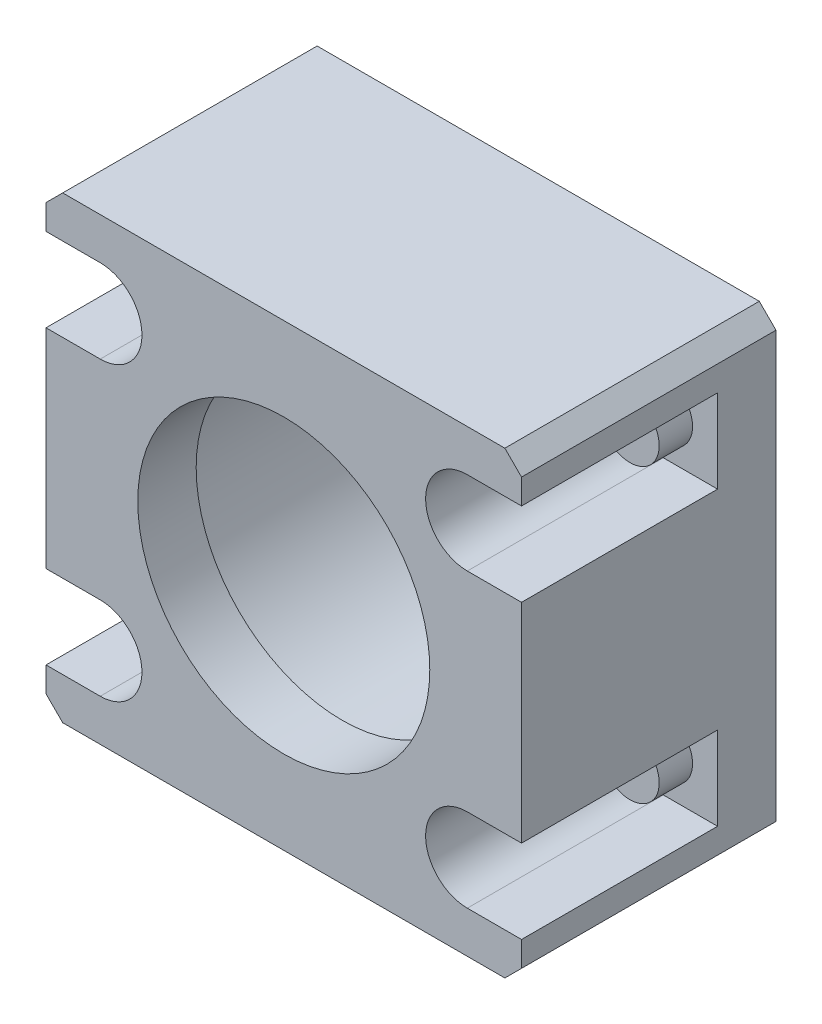
ISO-10303-21;
HEADER;
FILE_DESCRIPTION(('STEP AP214'),'2;1');
FILE_NAME('part.step','',(''),(''),'','','');
FILE_SCHEMA(('AUTOMOTIVE_DESIGN { 1 0 10303 214 1 1 1 1 }'));
ENDSEC;
DATA;
#1=APPLICATION_CONTEXT('core data for automotive mechanical design processes');
#2=APPLICATION_PROTOCOL_DEFINITION('international standard','automotive_design',2000,#1);
#3=PRODUCT_CONTEXT('',#1,'mechanical');
#4=PRODUCT('Part','Part','',(#3));
#5=PRODUCT_RELATED_PRODUCT_CATEGORY('part','',(#4));
#6=PRODUCT_DEFINITION_FORMATION('','',#4);
#7=PRODUCT_DEFINITION_CONTEXT('part definition',#1,'design');
#8=PRODUCT_DEFINITION('design','',#6,#7);
#9=PRODUCT_DEFINITION_SHAPE('','',#8);
#10=(LENGTH_UNIT() NAMED_UNIT(*) SI_UNIT(.MILLI.,.METRE.));
#11=(NAMED_UNIT(*) PLANE_ANGLE_UNIT() SI_UNIT($,.RADIAN.));
#12=(NAMED_UNIT(*) SI_UNIT($,.STERADIAN.) SOLID_ANGLE_UNIT());
#13=UNCERTAINTY_MEASURE_WITH_UNIT(LENGTH_MEASURE(1.E-05),#10,'distance_accuracy_value','');
#14=(GEOMETRIC_REPRESENTATION_CONTEXT(3) GLOBAL_UNCERTAINTY_ASSIGNED_CONTEXT((#13)) GLOBAL_UNIT_ASSIGNED_CONTEXT((#10,
#11,#12)) REPRESENTATION_CONTEXT('',''));
#15=CARTESIAN_POINT('',(0.,0.,0.));
#16=DIRECTION('',(0.,0.,1.));
#17=DIRECTION('',(1.,0.,0.));
#18=AXIS2_PLACEMENT_3D('',#15,#16,#17);
#19=CARTESIAN_POINT('',(0.,0.,11.));
#20=DIRECTION('',(0.,0.,1.));
#21=DIRECTION('',(1.,0.,0.));
#22=AXIS2_PLACEMENT_3D('',#19,#20,#21);
#23=PLANE('',#22);
#24=CARTESIAN_POINT('',(22.,-17.5,11.));
#25=DIRECTION('',(0.,0.,1.));
#26=DIRECTION('',(1.,0.,0.));
#27=AXIS2_PLACEMENT_3D('',#24,#25,#26);
#28=CIRCLE('',#27,3.5);
#29=CARTESIAN_POINT('',(25.5,-17.5,11.));
#30=VERTEX_POINT('',#29);
#31=EDGE_CURVE('E19',#30,#30,#28,.F.);
#32=ORIENTED_EDGE('',*,*,#31,.F.);
#33=EDGE_LOOP('',(#32));
#34=FACE_BOUND('',#33,.T.);
#35=ADVANCED_FACE('F16',(#34),#23,.T.);
#36=CARTESIAN_POINT('',(0.,0.,11.));
#37=DIRECTION('',(0.,0.,1.));
#38=DIRECTION('',(1.,0.,0.));
#39=AXIS2_PLACEMENT_3D('',#36,#37,#38);
#40=PLANE('',#39);
#41=CARTESIAN_POINT('',(22.,17.5,11.));
#42=DIRECTION('',(0.,0.,1.));
#43=DIRECTION('',(1.,0.,0.));
#44=AXIS2_PLACEMENT_3D('',#41,#42,#43);
#45=CIRCLE('',#44,3.5);
#46=CARTESIAN_POINT('',(25.5,17.5,11.));
#47=VERTEX_POINT('',#46);
#48=EDGE_CURVE('E273',#47,#47,#45,.F.);
#49=ORIENTED_EDGE('',*,*,#48,.F.);
#50=EDGE_LOOP('',(#49));
#51=FACE_BOUND('',#50,.T.);
#52=ADVANCED_FACE('F284',(#51),#40,.T.);
#53=CARTESIAN_POINT('',(0.,0.,11.));
#54=DIRECTION('',(0.,0.,1.));
#55=DIRECTION('',(1.,0.,0.));
#56=AXIS2_PLACEMENT_3D('',#53,#54,#55);
#57=PLANE('',#56);
#58=CARTESIAN_POINT('',(-22.,17.5,11.));
#59=DIRECTION('',(0.,0.,1.));
#60=DIRECTION('',(1.,0.,0.));
#61=AXIS2_PLACEMENT_3D('',#58,#59,#60);
#62=CIRCLE('',#61,3.5);
#63=CARTESIAN_POINT('',(-18.5,17.5,11.));
#64=VERTEX_POINT('',#63);
#65=EDGE_CURVE('E271',#64,#64,#62,.F.);
#66=ORIENTED_EDGE('',*,*,#65,.F.);
#67=EDGE_LOOP('',(#66));
#68=FACE_BOUND('',#67,.T.);
#69=ADVANCED_FACE('F289',(#68),#57,.T.);
#70=CARTESIAN_POINT('',(0.,0.,11.));
#71=DIRECTION('',(0.,0.,1.));
#72=DIRECTION('',(1.,0.,0.));
#73=AXIS2_PLACEMENT_3D('',#70,#71,#72);
#74=PLANE('',#73);
#75=CARTESIAN_POINT('',(-22.,-17.5,11.));
#76=DIRECTION('',(0.,0.,1.));
#77=DIRECTION('',(1.,0.,0.));
#78=AXIS2_PLACEMENT_3D('',#75,#76,#77);
#79=CIRCLE('',#78,3.5);
#80=CARTESIAN_POINT('',(-18.5,-17.5,11.));
#81=VERTEX_POINT('',#80);
#82=EDGE_CURVE('E268',#81,#81,#79,.F.);
#83=ORIENTED_EDGE('',*,*,#82,.F.);
#84=EDGE_LOOP('',(#83));
#85=FACE_BOUND('',#84,.T.);
#86=ADVANCED_FACE('F417',(#85),#74,.T.);
#87=CARTESIAN_POINT('',(22.,-17.5,7.));
#88=DIRECTION('',(0.,0.,1.));
#89=DIRECTION('',(1.,0.,0.));
#90=AXIS2_PLACEMENT_3D('',#87,#88,#89);
#91=CYLINDRICAL_SURFACE('',#90,3.5);
#92=ORIENTED_EDGE('',*,*,#31,.T.);
#93=EDGE_LOOP('',(#92));
#94=FACE_BOUND('',#93,.T.);
#95=CARTESIAN_POINT('',(22.,-17.5,7.));
#96=DIRECTION('',(0.,0.,1.));
#97=DIRECTION('',(1.,0.,0.));
#98=AXIS2_PLACEMENT_3D('',#95,#96,#97);
#99=CIRCLE('',#98,3.5);
#100=CARTESIAN_POINT('',(25.5,-17.5,7.));
#101=VERTEX_POINT('',#100);
#102=EDGE_CURVE('E190',#101,#101,#99,.F.);
#103=ORIENTED_EDGE('',*,*,#102,.F.);
#104=EDGE_LOOP('',(#103));
#105=FACE_BOUND('',#104,.T.);
#106=ADVANCED_FACE('F280',(#94,#105),#91,.T.);
#107=CARTESIAN_POINT('',(22.,17.5,7.));
#108=DIRECTION('',(0.,0.,1.));
#109=DIRECTION('',(1.,0.,0.));
#110=AXIS2_PLACEMENT_3D('',#107,#108,#109);
#111=CYLINDRICAL_SURFACE('',#110,3.5);
#112=ORIENTED_EDGE('',*,*,#48,.T.);
#113=EDGE_LOOP('',(#112));
#114=FACE_BOUND('',#113,.T.);
#115=CARTESIAN_POINT('',(22.,17.5,7.));
#116=DIRECTION('',(0.,0.,1.));
#117=DIRECTION('',(1.,0.,0.));
#118=AXIS2_PLACEMENT_3D('',#115,#116,#117);
#119=CIRCLE('',#118,3.5);
#120=CARTESIAN_POINT('',(25.5,17.5,7.));
#121=VERTEX_POINT('',#120);
#122=EDGE_CURVE('E259',#121,#121,#119,.F.);
#123=ORIENTED_EDGE('',*,*,#122,.F.);
#124=EDGE_LOOP('',(#123));
#125=FACE_BOUND('',#124,.T.);
#126=ADVANCED_FACE('F411',(#114,#125),#111,.T.);
#127=CARTESIAN_POINT('',(-22.,17.5,7.));
#128=DIRECTION('',(0.,0.,1.));
#129=DIRECTION('',(1.,0.,0.));
#130=AXIS2_PLACEMENT_3D('',#127,#128,#129);
#131=CYLINDRICAL_SURFACE('',#130,3.5);
#132=ORIENTED_EDGE('',*,*,#65,.T.);
#133=EDGE_LOOP('',(#132));
#134=FACE_BOUND('',#133,.T.);
#135=CARTESIAN_POINT('',(-22.,17.5,7.));
#136=DIRECTION('',(0.,0.,1.));
#137=DIRECTION('',(1.,0.,0.));
#138=AXIS2_PLACEMENT_3D('',#135,#136,#137);
#139=CIRCLE('',#138,3.5);
#140=CARTESIAN_POINT('',(-18.5,17.5,7.));
#141=VERTEX_POINT('',#140);
#142=EDGE_CURVE('E251',#141,#141,#139,.F.);
#143=ORIENTED_EDGE('',*,*,#142,.F.);
#144=EDGE_LOOP('',(#143));
#145=FACE_BOUND('',#144,.T.);
#146=ADVANCED_FACE('F407',(#134,#145),#131,.T.);
#147=CARTESIAN_POINT('',(-22.,-17.5,7.));
#148=DIRECTION('',(0.,0.,1.));
#149=DIRECTION('',(1.,0.,0.));
#150=AXIS2_PLACEMENT_3D('',#147,#148,#149);
#151=CYLINDRICAL_SURFACE('',#150,3.5);
#152=ORIENTED_EDGE('',*,*,#82,.T.);
#153=EDGE_LOOP('',(#152));
#154=FACE_BOUND('',#153,.T.);
#155=CARTESIAN_POINT('',(-22.,-17.5,7.));
#156=DIRECTION('',(0.,0.,1.));
#157=DIRECTION('',(1.,0.,0.));
#158=AXIS2_PLACEMENT_3D('',#155,#156,#157);
#159=CIRCLE('',#158,3.5);
#160=CARTESIAN_POINT('',(-18.5,-17.5,7.));
#161=VERTEX_POINT('',#160);
#162=EDGE_CURVE('E243',#161,#161,#159,.F.);
#163=ORIENTED_EDGE('',*,*,#162,.F.);
#164=EDGE_LOOP('',(#163));
#165=FACE_BOUND('',#164,.T.);
#166=ADVANCED_FACE('F403',(#154,#165),#151,.T.);
#167=CARTESIAN_POINT('',(22.,17.5,30.5));
#168=DIRECTION('',(0.,0.,1.));
#169=DIRECTION('',(1.,0.,0.));
#170=AXIS2_PLACEMENT_3D('',#167,#168,#169);
#171=CYLINDRICAL_SURFACE('',#170,5.);
#172=DIRECTION('',(0.,0.,-1.));
#173=VECTOR('',#172,1.);
#174=CARTESIAN_POINT('',(22.,12.5,30.5));
#175=LINE('',#174,#173);
#176=CARTESIAN_POINT('',(22.,12.5,30.5));
#177=VERTEX_POINT('',#176);
#178=CARTESIAN_POINT('',(22.,12.5,7.));
#179=VERTEX_POINT('',#178);
#180=EDGE_CURVE('E262',#177,#179,#175,.T.);
#181=ORIENTED_EDGE('',*,*,#180,.T.);
#182=CARTESIAN_POINT('',(22.,17.5,7.));
#183=DIRECTION('',(0.,0.,1.));
#184=DIRECTION('',(1.,0.,0.));
#185=AXIS2_PLACEMENT_3D('',#182,#183,#184);
#186=CIRCLE('',#185,5.);
#187=CARTESIAN_POINT('',(22.,22.5,7.));
#188=VERTEX_POINT('',#187);
#189=EDGE_CURVE('E263',#188,#179,#186,.T.);
#190=ORIENTED_EDGE('',*,*,#189,.F.);
#191=DIRECTION('',(0.,0.,1.));
#192=VECTOR('',#191,1.);
#193=CARTESIAN_POINT('',(22.,22.5,30.5));
#194=LINE('',#193,#192);
#195=CARTESIAN_POINT('',(22.,22.5,30.5));
#196=VERTEX_POINT('',#195);
#197=EDGE_CURVE('E202',#188,#196,#194,.T.);
#198=ORIENTED_EDGE('',*,*,#197,.T.);
#199=CARTESIAN_POINT('',(22.,17.5,30.5));
#200=DIRECTION('',(0.,0.,1.));
#201=DIRECTION('',(1.,0.,0.));
#202=AXIS2_PLACEMENT_3D('',#199,#200,#201);
#203=CIRCLE('',#202,5.);
#204=EDGE_CURVE('E239',#196,#177,#203,.T.);
#205=ORIENTED_EDGE('',*,*,#204,.T.);
#206=EDGE_LOOP('',(#181,#190,#198,#205));
#207=FACE_BOUND('',#206,.T.);
#208=ADVANCED_FACE('F400',(#207),#171,.F.);
#209=CARTESIAN_POINT('',(22.,-17.5,30.5));
#210=DIRECTION('',(0.,0.,1.));
#211=DIRECTION('',(1.,0.,0.));
#212=AXIS2_PLACEMENT_3D('',#209,#210,#211);
#213=CYLINDRICAL_SURFACE('',#212,5.);
#214=DIRECTION('',(0.,0.,1.));
#215=VECTOR('',#214,1.);
#216=CARTESIAN_POINT('',(22.,-12.5,30.5));
#217=LINE('',#216,#215);
#218=CARTESIAN_POINT('',(22.,-12.5,7.));
#219=VERTEX_POINT('',#218);
#220=CARTESIAN_POINT('',(22.,-12.5,30.5));
#221=VERTEX_POINT('',#220);
#222=EDGE_CURVE('E174',#219,#221,#217,.T.);
#223=ORIENTED_EDGE('',*,*,#222,.T.);
#224=CARTESIAN_POINT('',(22.,-17.5,30.5));
#225=DIRECTION('',(0.,0.,1.));
#226=DIRECTION('',(1.,0.,0.));
#227=AXIS2_PLACEMENT_3D('',#224,#225,#226);
#228=CIRCLE('',#227,5.);
#229=CARTESIAN_POINT('',(22.,-22.5,30.5));
#230=VERTEX_POINT('',#229);
#231=EDGE_CURVE('E185',#221,#230,#228,.T.);
#232=ORIENTED_EDGE('',*,*,#231,.T.);
#233=DIRECTION('',(0.,0.,-1.));
#234=VECTOR('',#233,1.);
#235=CARTESIAN_POINT('',(22.,-22.5,30.5));
#236=LINE('',#235,#234);
#237=CARTESIAN_POINT('',(22.,-22.5,7.));
#238=VERTEX_POINT('',#237);
#239=EDGE_CURVE('E179',#230,#238,#236,.T.);
#240=ORIENTED_EDGE('',*,*,#239,.T.);
#241=CARTESIAN_POINT('',(22.,-17.5,7.));
#242=DIRECTION('',(0.,0.,1.));
#243=DIRECTION('',(1.,0.,0.));
#244=AXIS2_PLACEMENT_3D('',#241,#242,#243);
#245=CIRCLE('',#244,5.);
#246=EDGE_CURVE('E182',#219,#238,#245,.T.);
#247=ORIENTED_EDGE('',*,*,#246,.F.);
#248=EDGE_LOOP('',(#223,#232,#240,#247));
#249=FACE_BOUND('',#248,.T.);
#250=ADVANCED_FACE('F181',(#249),#213,.F.);
#251=CARTESIAN_POINT('',(-22.,-17.5,30.5));
#252=DIRECTION('',(0.,0.,1.));
#253=DIRECTION('',(1.,0.,0.));
#254=AXIS2_PLACEMENT_3D('',#251,#252,#253);
#255=CYLINDRICAL_SURFACE('',#254,5.);
#256=DIRECTION('',(0.,0.,1.));
#257=VECTOR('',#256,1.);
#258=CARTESIAN_POINT('',(-22.,-12.5,30.5));
#259=LINE('',#258,#257);
#260=CARTESIAN_POINT('',(-22.,-12.5,30.5));
#261=VERTEX_POINT('',#260);
#262=CARTESIAN_POINT('',(-22.,-12.5,7.));
#263=VERTEX_POINT('',#262);
#264=EDGE_CURVE('E246',#261,#263,#259,.F.);
#265=ORIENTED_EDGE('',*,*,#264,.T.);
#266=CARTESIAN_POINT('',(-22.,-17.5,7.));
#267=DIRECTION('',(0.,0.,1.));
#268=DIRECTION('',(1.,0.,0.));
#269=AXIS2_PLACEMENT_3D('',#266,#267,#268);
#270=CIRCLE('',#269,5.);
#271=CARTESIAN_POINT('',(-22.,-22.5,7.));
#272=VERTEX_POINT('',#271);
#273=EDGE_CURVE('E247',#272,#263,#270,.T.);
#274=ORIENTED_EDGE('',*,*,#273,.F.);
#275=DIRECTION('',(0.,0.,-1.));
#276=VECTOR('',#275,1.);
#277=CARTESIAN_POINT('',(-22.,-22.5,30.5));
#278=LINE('',#277,#276);
#279=CARTESIAN_POINT('',(-22.,-22.5,30.5));
#280=VERTEX_POINT('',#279);
#281=EDGE_CURVE('E436',#272,#280,#278,.F.);
#282=ORIENTED_EDGE('',*,*,#281,.T.);
#283=CARTESIAN_POINT('',(-22.,-17.5,30.5));
#284=DIRECTION('',(0.,0.,1.));
#285=DIRECTION('',(1.,0.,0.));
#286=AXIS2_PLACEMENT_3D('',#283,#284,#285);
#287=CIRCLE('',#286,5.);
#288=EDGE_CURVE('E232',#280,#261,#287,.T.);
#289=ORIENTED_EDGE('',*,*,#288,.T.);
#290=EDGE_LOOP('',(#265,#274,#282,#289));
#291=FACE_BOUND('',#290,.T.);
#292=ADVANCED_FACE('F393',(#291),#255,.F.);
#293=CARTESIAN_POINT('',(-22.,17.5,30.5));
#294=DIRECTION('',(0.,0.,1.));
#295=DIRECTION('',(1.,0.,0.));
#296=AXIS2_PLACEMENT_3D('',#293,#294,#295);
#297=CYLINDRICAL_SURFACE('',#296,5.);
#298=DIRECTION('',(0.,0.,-1.));
#299=VECTOR('',#298,1.);
#300=CARTESIAN_POINT('',(-22.,12.5,30.5));
#301=LINE('',#300,#299);
#302=CARTESIAN_POINT('',(-22.,12.5,7.));
#303=VERTEX_POINT('',#302);
#304=CARTESIAN_POINT('',(-22.,12.5,30.5));
#305=VERTEX_POINT('',#304);
#306=EDGE_CURVE('E503',#303,#305,#301,.F.);
#307=ORIENTED_EDGE('',*,*,#306,.T.);
#308=CARTESIAN_POINT('',(-22.,17.5,30.5));
#309=DIRECTION('',(0.,0.,1.));
#310=DIRECTION('',(1.,0.,0.));
#311=AXIS2_PLACEMENT_3D('',#308,#309,#310);
#312=CIRCLE('',#311,5.);
#313=CARTESIAN_POINT('',(-22.,22.5,30.5));
#314=VERTEX_POINT('',#313);
#315=EDGE_CURVE('E228',#305,#314,#312,.T.);
#316=ORIENTED_EDGE('',*,*,#315,.T.);
#317=DIRECTION('',(0.,0.,1.));
#318=VECTOR('',#317,1.);
#319=CARTESIAN_POINT('',(-22.,22.5,30.5));
#320=LINE('',#319,#318);
#321=CARTESIAN_POINT('',(-22.,22.5,7.));
#322=VERTEX_POINT('',#321);
#323=EDGE_CURVE('E254',#314,#322,#320,.F.);
#324=ORIENTED_EDGE('',*,*,#323,.T.);
#325=CARTESIAN_POINT('',(-22.,17.5,7.));
#326=DIRECTION('',(0.,0.,1.));
#327=DIRECTION('',(1.,0.,0.));
#328=AXIS2_PLACEMENT_3D('',#325,#326,#327);
#329=CIRCLE('',#328,5.);
#330=EDGE_CURVE('E255',#303,#322,#329,.T.);
#331=ORIENTED_EDGE('',*,*,#330,.F.);
#332=EDGE_LOOP('',(#307,#316,#324,#331));
#333=FACE_BOUND('',#332,.T.);
#334=ADVANCED_FACE('F389',(#333),#297,.F.);
#335=CARTESIAN_POINT('',(0.,0.,32.025));
#336=DIRECTION('',(0.,0.,-1.));
#337=DIRECTION('',(-1.,0.,0.));
#338=AXIS2_PLACEMENT_3D('',#335,#336,#337);
#339=CYLINDRICAL_SURFACE('',#338,17.5);
#340=CARTESIAN_POINT('',(0.,0.,23.5));
#341=DIRECTION('',(0.,0.,-1.));
#342=DIRECTION('',(-1.,0.,0.));
#343=AXIS2_PLACEMENT_3D('',#340,#341,#342);
#344=CIRCLE('',#343,17.5);
#345=CARTESIAN_POINT('',(-17.5,0.,23.5));
#346=VERTEX_POINT('',#345);
#347=EDGE_CURVE('E221',#346,#346,#344,.F.);
#348=ORIENTED_EDGE('',*,*,#347,.F.);
#349=EDGE_LOOP('',(#348));
#350=FACE_BOUND('',#349,.T.);
#351=CARTESIAN_POINT('',(0.,0.,30.5));
#352=DIRECTION('',(0.,0.,-1.));
#353=DIRECTION('',(-1.,0.,0.));
#354=AXIS2_PLACEMENT_3D('',#351,#352,#353);
#355=CIRCLE('',#354,17.5);
#356=CARTESIAN_POINT('',(-17.5,0.,30.5));
#357=VERTEX_POINT('',#356);
#358=EDGE_CURVE('E225',#357,#357,#355,.F.);
#359=ORIENTED_EDGE('',*,*,#358,.T.);
#360=EDGE_LOOP('',(#359));
#361=FACE_BOUND('',#360,.T.);
#362=ADVANCED_FACE('F386',(#350,#361),#339,.F.);
#363=CARTESIAN_POINT('',(28.5,-12.5,30.5));
#364=DIRECTION('',(0.,1.,0.));
#365=DIRECTION('',(0.,0.,1.));
#366=AXIS2_PLACEMENT_3D('',#363,#364,#365);
#367=PLANE('',#366);
#368=ORIENTED_EDGE('',*,*,#222,.F.);
#369=DIRECTION('',(1.,0.,0.));
#370=VECTOR('',#369,1.);
#371=CARTESIAN_POINT('',(0.,-12.5,7.));
#372=LINE('',#371,#370);
#373=CARTESIAN_POINT('',(28.5,-12.5,7.));
#374=VERTEX_POINT('',#373);
#375=EDGE_CURVE('E196',#374,#219,#372,.F.);
#376=ORIENTED_EDGE('',*,*,#375,.F.);
#377=DIRECTION('',(0.,0.,-1.));
#378=VECTOR('',#377,1.);
#379=CARTESIAN_POINT('',(28.5,-12.5,0.));
#380=LINE('',#379,#378);
#381=CARTESIAN_POINT('',(28.5,-12.5,30.5));
#382=VERTEX_POINT('',#381);
#383=EDGE_CURVE('E214',#382,#374,#380,.T.);
#384=ORIENTED_EDGE('',*,*,#383,.F.);
#385=DIRECTION('',(-1.,0.,0.));
#386=VECTOR('',#385,1.);
#387=CARTESIAN_POINT('',(0.,-12.5,30.5));
#388=LINE('',#387,#386);
#389=EDGE_CURVE('E238',#382,#221,#388,.T.);
#390=ORIENTED_EDGE('',*,*,#389,.T.);
#391=EDGE_LOOP('',(#368,#376,#384,#390));
#392=FACE_BOUND('',#391,.T.);
#393=ADVANCED_FACE('F382',(#392),#367,.F.);
#394=CARTESIAN_POINT('',(0.,0.,7.));
#395=DIRECTION('',(0.,0.,1.));
#396=DIRECTION('',(1.,0.,0.));
#397=AXIS2_PLACEMENT_3D('',#394,#395,#396);
#398=PLANE('',#397);
#399=ORIENTED_EDGE('',*,*,#102,.T.);
#400=EDGE_LOOP('',(#399));
#401=FACE_BOUND('',#400,.T.);
#402=DIRECTION('',(1.,0.,0.));
#403=VECTOR('',#402,1.);
#404=CARTESIAN_POINT('',(22.,-22.5,7.));
#405=LINE('',#404,#403);
#406=CARTESIAN_POINT('',(28.5,-22.5,7.));
#407=VERTEX_POINT('',#406);
#408=EDGE_CURVE('E189',#238,#407,#405,.T.);
#409=ORIENTED_EDGE('',*,*,#408,.T.);
#410=DIRECTION('',(0.,1.,0.));
#411=VECTOR('',#410,1.);
#412=CARTESIAN_POINT('',(28.5,27.5,7.));
#413=LINE('',#412,#411);
#414=EDGE_CURVE('E212',#374,#407,#413,.F.);
#415=ORIENTED_EDGE('',*,*,#414,.F.);
#416=ORIENTED_EDGE('',*,*,#375,.T.);
#417=ORIENTED_EDGE('',*,*,#246,.T.);
#418=EDGE_LOOP('',(#409,#415,#416,#417));
#419=FACE_BOUND('',#418,.T.);
#420=ADVANCED_FACE('F193',(#401,#419),#398,.T.);
#421=CARTESIAN_POINT('',(22.,-22.5,30.5));
#422=DIRECTION('',(0.,-1.,0.));
#423=DIRECTION('',(0.,0.,-1.));
#424=AXIS2_PLACEMENT_3D('',#421,#422,#423);
#425=PLANE('',#424);
#426=DIRECTION('',(0.,0.,-1.));
#427=VECTOR('',#426,1.);
#428=CARTESIAN_POINT('',(28.5,-22.5,0.));
#429=LINE('',#428,#427);
#430=CARTESIAN_POINT('',(28.5,-22.5,30.5));
#431=VERTEX_POINT('',#430);
#432=EDGE_CURVE('E200',#407,#431,#429,.F.);
#433=ORIENTED_EDGE('',*,*,#432,.F.);
#434=ORIENTED_EDGE('',*,*,#408,.F.);
#435=ORIENTED_EDGE('',*,*,#239,.F.);
#436=DIRECTION('',(-1.,0.,0.));
#437=VECTOR('',#436,1.);
#438=CARTESIAN_POINT('',(0.,-22.5,30.5));
#439=LINE('',#438,#437);
#440=EDGE_CURVE('E237',#230,#431,#439,.F.);
#441=ORIENTED_EDGE('',*,*,#440,.T.);
#442=EDGE_LOOP('',(#433,#434,#435,#441));
#443=FACE_BOUND('',#442,.T.);
#444=ADVANCED_FACE('F198',(#443),#425,.F.);
#445=CARTESIAN_POINT('',(28.5,22.5,30.5));
#446=DIRECTION('',(0.,1.,0.));
#447=DIRECTION('',(0.,0.,1.));
#448=AXIS2_PLACEMENT_3D('',#445,#446,#447);
#449=PLANE('',#448);
#450=DIRECTION('',(0.,0.,-1.));
#451=VECTOR('',#450,1.);
#452=CARTESIAN_POINT('',(28.5,22.5,0.));
#453=LINE('',#452,#451);
#454=CARTESIAN_POINT('',(28.5,22.5,30.5));
#455=VERTEX_POINT('',#454);
#456=CARTESIAN_POINT('',(28.5,22.5,7.));
#457=VERTEX_POINT('',#456);
#458=EDGE_CURVE('E479',#455,#457,#453,.T.);
#459=ORIENTED_EDGE('',*,*,#458,.F.);
#460=DIRECTION('',(-1.,0.,0.));
#461=VECTOR('',#460,1.);
#462=CARTESIAN_POINT('',(0.,22.5,30.5));
#463=LINE('',#462,#461);
#464=EDGE_CURVE('E242',#455,#196,#463,.T.);
#465=ORIENTED_EDGE('',*,*,#464,.T.);
#466=ORIENTED_EDGE('',*,*,#197,.F.);
#467=DIRECTION('',(1.,0.,0.));
#468=VECTOR('',#467,1.);
#469=CARTESIAN_POINT('',(0.,22.5,7.));
#470=LINE('',#469,#468);
#471=EDGE_CURVE('E204',#457,#188,#470,.F.);
#472=ORIENTED_EDGE('',*,*,#471,.F.);
#473=EDGE_LOOP('',(#459,#465,#466,#472));
#474=FACE_BOUND('',#473,.T.);
#475=ADVANCED_FACE('F373',(#474),#449,.F.);
#476=CARTESIAN_POINT('',(0.,0.,7.));
#477=DIRECTION('',(0.,0.,1.));
#478=DIRECTION('',(1.,0.,0.));
#479=AXIS2_PLACEMENT_3D('',#476,#477,#478);
#480=PLANE('',#479);
#481=ORIENTED_EDGE('',*,*,#122,.T.);
#482=EDGE_LOOP('',(#481));
#483=FACE_BOUND('',#482,.T.);
#484=DIRECTION('',(1.,0.,0.));
#485=VECTOR('',#484,1.);
#486=CARTESIAN_POINT('',(22.,12.5,7.));
#487=LINE('',#486,#485);
#488=CARTESIAN_POINT('',(28.5,12.5,7.));
#489=VERTEX_POINT('',#488);
#490=EDGE_CURVE('E258',#179,#489,#487,.T.);
#491=ORIENTED_EDGE('',*,*,#490,.T.);
#492=DIRECTION('',(0.,1.,0.));
#493=VECTOR('',#492,1.);
#494=CARTESIAN_POINT('',(28.5,27.5,7.));
#495=LINE('',#494,#493);
#496=EDGE_CURVE('E476',#457,#489,#495,.F.);
#497=ORIENTED_EDGE('',*,*,#496,.F.);
#498=ORIENTED_EDGE('',*,*,#471,.T.);
#499=ORIENTED_EDGE('',*,*,#189,.T.);
#500=EDGE_LOOP('',(#491,#497,#498,#499));
#501=FACE_BOUND('',#500,.T.);
#502=ADVANCED_FACE('F369',(#483,#501),#480,.T.);
#503=CARTESIAN_POINT('',(22.,12.5,30.5));
#504=DIRECTION('',(0.,-1.,0.));
#505=DIRECTION('',(0.,0.,-1.));
#506=AXIS2_PLACEMENT_3D('',#503,#504,#505);
#507=PLANE('',#506);
#508=ORIENTED_EDGE('',*,*,#180,.F.);
#509=DIRECTION('',(-1.,0.,0.));
#510=VECTOR('',#509,1.);
#511=CARTESIAN_POINT('',(0.,12.5,30.5));
#512=LINE('',#511,#510);
#513=CARTESIAN_POINT('',(28.5,12.5,30.5));
#514=VERTEX_POINT('',#513);
#515=EDGE_CURVE('E241',#177,#514,#512,.F.);
#516=ORIENTED_EDGE('',*,*,#515,.T.);
#517=DIRECTION('',(0.,0.,-1.));
#518=VECTOR('',#517,1.);
#519=CARTESIAN_POINT('',(28.5,12.5,0.));
#520=LINE('',#519,#518);
#521=EDGE_CURVE('E478',#489,#514,#520,.F.);
#522=ORIENTED_EDGE('',*,*,#521,.F.);
#523=ORIENTED_EDGE('',*,*,#490,.F.);
#524=EDGE_LOOP('',(#508,#516,#522,#523));
#525=FACE_BOUND('',#524,.T.);
#526=ADVANCED_FACE('F365',(#525),#507,.F.);
#527=CARTESIAN_POINT('',(0.,0.,7.));
#528=DIRECTION('',(0.,0.,1.));
#529=DIRECTION('',(1.,0.,0.));
#530=AXIS2_PLACEMENT_3D('',#527,#528,#529);
#531=PLANE('',#530);
#532=ORIENTED_EDGE('',*,*,#142,.T.);
#533=EDGE_LOOP('',(#532));
#534=FACE_BOUND('',#533,.T.);
#535=DIRECTION('',(1.,0.,0.));
#536=VECTOR('',#535,1.);
#537=CARTESIAN_POINT('',(-22.,22.5,7.));
#538=LINE('',#537,#536);
#539=CARTESIAN_POINT('',(-28.5,22.5,7.));
#540=VERTEX_POINT('',#539);
#541=EDGE_CURVE('E430',#322,#540,#538,.F.);
#542=ORIENTED_EDGE('',*,*,#541,.T.);
#543=DIRECTION('',(0.,1.,0.));
#544=VECTOR('',#543,1.);
#545=CARTESIAN_POINT('',(-28.5,-27.5,7.));
#546=LINE('',#545,#544);
#547=CARTESIAN_POINT('',(-28.5,12.5,7.));
#548=VERTEX_POINT('',#547);
#549=EDGE_CURVE('E434',#548,#540,#546,.T.);
#550=ORIENTED_EDGE('',*,*,#549,.F.);
#551=DIRECTION('',(1.,0.,0.));
#552=VECTOR('',#551,1.);
#553=CARTESIAN_POINT('',(-28.5,12.5,7.));
#554=LINE('',#553,#552);
#555=EDGE_CURVE('E462',#548,#303,#554,.T.);
#556=ORIENTED_EDGE('',*,*,#555,.T.);
#557=ORIENTED_EDGE('',*,*,#330,.T.);
#558=EDGE_LOOP('',(#542,#550,#556,#557));
#559=FACE_BOUND('',#558,.T.);
#560=ADVANCED_FACE('F361',(#534,#559),#531,.T.);
#561=CARTESIAN_POINT('',(-22.,22.5,30.5));
#562=DIRECTION('',(0.,1.,0.));
#563=DIRECTION('',(0.,0.,1.));
#564=AXIS2_PLACEMENT_3D('',#561,#562,#563);
#565=PLANE('',#564);
#566=DIRECTION('',(0.,0.,1.));
#567=VECTOR('',#566,1.);
#568=CARTESIAN_POINT('',(-28.5,22.5,0.));
#569=LINE('',#568,#567);
#570=CARTESIAN_POINT('',(-28.5,22.5,30.5));
#571=VERTEX_POINT('',#570);
#572=EDGE_CURVE('E439',#540,#571,#569,.T.);
#573=ORIENTED_EDGE('',*,*,#572,.F.);
#574=ORIENTED_EDGE('',*,*,#541,.F.);
#575=ORIENTED_EDGE('',*,*,#323,.F.);
#576=DIRECTION('',(-1.,0.,0.));
#577=VECTOR('',#576,1.);
#578=CARTESIAN_POINT('',(0.,22.5,30.5));
#579=LINE('',#578,#577);
#580=EDGE_CURVE('E441',#314,#571,#579,.T.);
#581=ORIENTED_EDGE('',*,*,#580,.T.);
#582=EDGE_LOOP('',(#573,#574,#575,#581));
#583=FACE_BOUND('',#582,.T.);
#584=ADVANCED_FACE('F357',(#583),#565,.F.);
#585=CARTESIAN_POINT('',(-28.5,-22.5,30.5));
#586=DIRECTION('',(0.,-1.,0.));
#587=DIRECTION('',(0.,0.,-1.));
#588=AXIS2_PLACEMENT_3D('',#585,#586,#587);
#589=PLANE('',#588);
#590=DIRECTION('',(0.,0.,1.));
#591=VECTOR('',#590,1.);
#592=CARTESIAN_POINT('',(-28.5,-22.5,0.));
#593=LINE('',#592,#591);
#594=CARTESIAN_POINT('',(-28.5,-22.5,30.5));
#595=VERTEX_POINT('',#594);
#596=CARTESIAN_POINT('',(-28.5,-22.5,7.));
#597=VERTEX_POINT('',#596);
#598=EDGE_CURVE('E469',#595,#597,#593,.F.);
#599=ORIENTED_EDGE('',*,*,#598,.F.);
#600=DIRECTION('',(-1.,0.,0.));
#601=VECTOR('',#600,1.);
#602=CARTESIAN_POINT('',(0.,-22.5,30.5));
#603=LINE('',#602,#601);
#604=EDGE_CURVE('E235',#595,#280,#603,.F.);
#605=ORIENTED_EDGE('',*,*,#604,.T.);
#606=ORIENTED_EDGE('',*,*,#281,.F.);
#607=DIRECTION('',(1.,0.,0.));
#608=VECTOR('',#607,1.);
#609=CARTESIAN_POINT('',(0.,-22.5,7.));
#610=LINE('',#609,#608);
#611=EDGE_CURVE('E250',#597,#272,#610,.T.);
#612=ORIENTED_EDGE('',*,*,#611,.F.);
#613=EDGE_LOOP('',(#599,#605,#606,#612));
#614=FACE_BOUND('',#613,.T.);
#615=ADVANCED_FACE('F353',(#614),#589,.F.);
#616=CARTESIAN_POINT('',(0.,0.,7.));
#617=DIRECTION('',(0.,0.,1.));
#618=DIRECTION('',(1.,0.,0.));
#619=AXIS2_PLACEMENT_3D('',#616,#617,#618);
#620=PLANE('',#619);
#621=ORIENTED_EDGE('',*,*,#162,.T.);
#622=EDGE_LOOP('',(#621));
#623=FACE_BOUND('',#622,.T.);
#624=DIRECTION('',(1.,0.,0.));
#625=VECTOR('',#624,1.);
#626=CARTESIAN_POINT('',(-22.,-12.5,7.));
#627=LINE('',#626,#625);
#628=CARTESIAN_POINT('',(-28.5,-12.5,7.));
#629=VERTEX_POINT('',#628);
#630=EDGE_CURVE('E460',#263,#629,#627,.F.);
#631=ORIENTED_EDGE('',*,*,#630,.T.);
#632=DIRECTION('',(0.,1.,0.));
#633=VECTOR('',#632,1.);
#634=CARTESIAN_POINT('',(-28.5,-27.5,7.));
#635=LINE('',#634,#633);
#636=EDGE_CURVE('E465',#597,#629,#635,.T.);
#637=ORIENTED_EDGE('',*,*,#636,.F.);
#638=ORIENTED_EDGE('',*,*,#611,.T.);
#639=ORIENTED_EDGE('',*,*,#273,.T.);
#640=EDGE_LOOP('',(#631,#637,#638,#639));
#641=FACE_BOUND('',#640,.T.);
#642=ADVANCED_FACE('F349',(#623,#641),#620,.T.);
#643=CARTESIAN_POINT('',(-22.,-12.5,30.5));
#644=DIRECTION('',(0.,1.,0.));
#645=DIRECTION('',(0.,0.,1.));
#646=AXIS2_PLACEMENT_3D('',#643,#644,#645);
#647=PLANE('',#646);
#648=ORIENTED_EDGE('',*,*,#264,.F.);
#649=DIRECTION('',(-1.,0.,0.));
#650=VECTOR('',#649,1.);
#651=CARTESIAN_POINT('',(0.,-12.5,30.5));
#652=LINE('',#651,#650);
#653=CARTESIAN_POINT('',(-28.5,-12.5,30.5));
#654=VERTEX_POINT('',#653);
#655=EDGE_CURVE('E234',#261,#654,#652,.T.);
#656=ORIENTED_EDGE('',*,*,#655,.T.);
#657=DIRECTION('',(0.,0.,1.));
#658=VECTOR('',#657,1.);
#659=CARTESIAN_POINT('',(-28.5,-12.5,0.));
#660=LINE('',#659,#658);
#661=EDGE_CURVE('E468',#629,#654,#660,.T.);
#662=ORIENTED_EDGE('',*,*,#661,.F.);
#663=ORIENTED_EDGE('',*,*,#630,.F.);
#664=EDGE_LOOP('',(#648,#656,#662,#663));
#665=FACE_BOUND('',#664,.T.);
#666=ADVANCED_FACE('F345',(#665),#647,.F.);
#667=CARTESIAN_POINT('',(-28.5,12.5,30.5));
#668=DIRECTION('',(0.,-1.,0.));
#669=DIRECTION('',(0.,0.,-1.));
#670=AXIS2_PLACEMENT_3D('',#667,#668,#669);
#671=PLANE('',#670);
#672=ORIENTED_EDGE('',*,*,#306,.F.);
#673=ORIENTED_EDGE('',*,*,#555,.F.);
#674=DIRECTION('',(0.,0.,1.));
#675=VECTOR('',#674,1.);
#676=CARTESIAN_POINT('',(-28.5,12.5,0.));
#677=LINE('',#676,#675);
#678=CARTESIAN_POINT('',(-28.5,12.5,30.5));
#679=VERTEX_POINT('',#678);
#680=EDGE_CURVE('E448',#679,#548,#677,.F.);
#681=ORIENTED_EDGE('',*,*,#680,.F.);
#682=DIRECTION('',(-1.,0.,0.));
#683=VECTOR('',#682,1.);
#684=CARTESIAN_POINT('',(0.,12.5,30.5));
#685=LINE('',#684,#683);
#686=EDGE_CURVE('E231',#679,#305,#685,.F.);
#687=ORIENTED_EDGE('',*,*,#686,.T.);
#688=EDGE_LOOP('',(#672,#673,#681,#687));
#689=FACE_BOUND('',#688,.T.);
#690=ADVANCED_FACE('F341',(#689),#671,.F.);
#691=CARTESIAN_POINT('',(0.,0.,30.5));
#692=DIRECTION('',(0.,0.,-1.));
#693=DIRECTION('',(-1.,0.,0.));
#694=AXIS2_PLACEMENT_3D('',#691,#692,#693);
#695=PLANE('',#694);
#696=ORIENTED_EDGE('',*,*,#358,.F.);
#697=EDGE_LOOP('',(#696));
#698=FACE_BOUND('',#697,.T.);
#699=ORIENTED_EDGE('',*,*,#686,.F.);
#700=DIRECTION('',(0.,1.,0.));
#701=VECTOR('',#700,1.);
#702=CARTESIAN_POINT('',(-28.5,-27.5,30.5));
#703=LINE('',#702,#701);
#704=EDGE_CURVE('E514',#654,#679,#703,.T.);
#705=ORIENTED_EDGE('',*,*,#704,.F.);
#706=ORIENTED_EDGE('',*,*,#655,.F.);
#707=ORIENTED_EDGE('',*,*,#288,.F.);
#708=ORIENTED_EDGE('',*,*,#604,.F.);
#709=DIRECTION('',(0.,1.,0.));
#710=VECTOR('',#709,1.);
#711=CARTESIAN_POINT('',(-28.5,-27.5,30.5));
#712=LINE('',#711,#710);
#713=CARTESIAN_POINT('',(-28.5,-25.5,30.5));
#714=VERTEX_POINT('',#713);
#715=EDGE_CURVE('E528',#714,#595,#712,.T.);
#716=ORIENTED_EDGE('',*,*,#715,.F.);
#717=DIRECTION('',(0.707106781186548,-0.707106781186548,0.));
#718=VECTOR('',#717,1.);
#719=CARTESIAN_POINT('',(-27.5,-26.5,30.5));
#720=LINE('',#719,#718);
#721=CARTESIAN_POINT('',(-26.5,-27.5,30.5));
#722=VERTEX_POINT('',#721);
#723=EDGE_CURVE('E452',#722,#714,#720,.F.);
#724=ORIENTED_EDGE('',*,*,#723,.F.);
#725=DIRECTION('',(1.,0.,0.));
#726=VECTOR('',#725,1.);
#727=CARTESIAN_POINT('',(28.5,-27.5,30.5));
#728=LINE('',#727,#726);
#729=CARTESIAN_POINT('',(26.5,-27.5,30.5));
#730=VERTEX_POINT('',#729);
#731=EDGE_CURVE('E575',#730,#722,#728,.F.);
#732=ORIENTED_EDGE('',*,*,#731,.F.);
#733=DIRECTION('',(0.707106781186548,0.707106781186548,0.));
#734=VECTOR('',#733,1.);
#735=CARTESIAN_POINT('',(27.5,-26.5,30.5));
#736=LINE('',#735,#734);
#737=CARTESIAN_POINT('',(28.5,-25.5,30.5));
#738=VERTEX_POINT('',#737);
#739=EDGE_CURVE('E483',#738,#730,#736,.F.);
#740=ORIENTED_EDGE('',*,*,#739,.F.);
#741=DIRECTION('',(0.,1.,0.));
#742=VECTOR('',#741,1.);
#743=CARTESIAN_POINT('',(28.5,27.5,30.5));
#744=LINE('',#743,#742);
#745=EDGE_CURVE('E489',#431,#738,#744,.F.);
#746=ORIENTED_EDGE('',*,*,#745,.F.);
#747=ORIENTED_EDGE('',*,*,#440,.F.);
#748=ORIENTED_EDGE('',*,*,#231,.F.);
#749=ORIENTED_EDGE('',*,*,#389,.F.);
#750=DIRECTION('',(0.,1.,0.));
#751=VECTOR('',#750,1.);
#752=CARTESIAN_POINT('',(28.5,27.5,30.5));
#753=LINE('',#752,#751);
#754=EDGE_CURVE('E224',#514,#382,#753,.F.);
#755=ORIENTED_EDGE('',*,*,#754,.F.);
#756=ORIENTED_EDGE('',*,*,#515,.F.);
#757=ORIENTED_EDGE('',*,*,#204,.F.);
#758=ORIENTED_EDGE('',*,*,#464,.F.);
#759=DIRECTION('',(0.,1.,0.));
#760=VECTOR('',#759,1.);
#761=CARTESIAN_POINT('',(28.5,27.5,30.5));
#762=LINE('',#761,#760);
#763=CARTESIAN_POINT('',(28.5,25.5,30.5));
#764=VERTEX_POINT('',#763);
#765=EDGE_CURVE('E485',#764,#455,#762,.F.);
#766=ORIENTED_EDGE('',*,*,#765,.F.);
#767=DIRECTION('',(-0.707106781186548,0.707106781186548,0.));
#768=VECTOR('',#767,1.);
#769=CARTESIAN_POINT('',(27.5,26.5,30.5));
#770=LINE('',#769,#768);
#771=CARTESIAN_POINT('',(26.5,27.5,30.5));
#772=VERTEX_POINT('',#771);
#773=EDGE_CURVE('E645',#772,#764,#770,.F.);
#774=ORIENTED_EDGE('',*,*,#773,.F.);
#775=DIRECTION('',(1.,0.,0.));
#776=VECTOR('',#775,1.);
#777=CARTESIAN_POINT('',(-28.5,27.5,30.5));
#778=LINE('',#777,#776);
#779=CARTESIAN_POINT('',(-26.5,27.5,30.5));
#780=VERTEX_POINT('',#779);
#781=EDGE_CURVE('E648',#780,#772,#778,.T.);
#782=ORIENTED_EDGE('',*,*,#781,.F.);
#783=DIRECTION('',(-0.707106781186548,-0.707106781186548,0.));
#784=VECTOR('',#783,1.);
#785=CARTESIAN_POINT('',(-27.5,26.5,30.5));
#786=LINE('',#785,#784);
#787=CARTESIAN_POINT('',(-28.5,25.5,30.5));
#788=VERTEX_POINT('',#787);
#789=EDGE_CURVE('E653',#788,#780,#786,.F.);
#790=ORIENTED_EDGE('',*,*,#789,.F.);
#791=DIRECTION('',(0.,1.,0.));
#792=VECTOR('',#791,1.);
#793=CARTESIAN_POINT('',(-28.5,-27.5,30.5));
#794=LINE('',#793,#792);
#795=EDGE_CURVE('E443',#571,#788,#794,.T.);
#796=ORIENTED_EDGE('',*,*,#795,.F.);
#797=ORIENTED_EDGE('',*,*,#580,.F.);
#798=ORIENTED_EDGE('',*,*,#315,.F.);
#799=EDGE_LOOP('',(#699,#705,#706,#707,#708,#716,#724,#732,#740,#746,#747,#748,#749,#755,#756,
#757,#758,#766,#774,#782,#790,#796,#797,#798));
#800=FACE_BOUND('',#799,.T.);
#801=ADVANCED_FACE('F337',(#698,#800),#695,.F.);
#802=CARTESIAN_POINT('',(0.,0.,23.5));
#803=DIRECTION('',(0.,0.,-1.));
#804=DIRECTION('',(-1.,0.,0.));
#805=AXIS2_PLACEMENT_3D('',#802,#803,#804);
#806=PLANE('',#805);
#807=ORIENTED_EDGE('',*,*,#347,.T.);
#808=EDGE_LOOP('',(#807));
#809=FACE_BOUND('',#808,.T.);
#810=CARTESIAN_POINT('',(0.,0.,23.5));
#811=DIRECTION('',(0.,0.,-1.));
#812=DIRECTION('',(-1.,0.,0.));
#813=AXIS2_PLACEMENT_3D('',#810,#811,#812);
#814=CIRCLE('',#813,20.);
#815=CARTESIAN_POINT('',(-20.,0.,23.5));
#816=VERTEX_POINT('',#815);
#817=EDGE_CURVE('E217',#816,#816,#814,.T.);
#818=ORIENTED_EDGE('',*,*,#817,.T.);
#819=EDGE_LOOP('',(#818));
#820=FACE_BOUND('',#819,.T.);
#821=ADVANCED_FACE('F333',(#809,#820),#806,.T.);
#822=CARTESIAN_POINT('',(28.5,27.5,0.));
#823=DIRECTION('',(1.,0.,0.));
#824=DIRECTION('',(0.,0.,-1.));
#825=AXIS2_PLACEMENT_3D('',#822,#823,#824);
#826=PLANE('',#825);
#827=ORIENTED_EDGE('',*,*,#496,.T.);
#828=ORIENTED_EDGE('',*,*,#521,.T.);
#829=ORIENTED_EDGE('',*,*,#754,.T.);
#830=ORIENTED_EDGE('',*,*,#383,.T.);
#831=ORIENTED_EDGE('',*,*,#414,.T.);
#832=ORIENTED_EDGE('',*,*,#432,.T.);
#833=ORIENTED_EDGE('',*,*,#745,.T.);
#834=DIRECTION('',(0.,0.,1.));
#835=VECTOR('',#834,1.);
#836=CARTESIAN_POINT('',(28.5,-25.5,15.25));
#837=LINE('',#836,#835);
#838=CARTESIAN_POINT('',(28.5,-25.5,0.));
#839=VERTEX_POINT('',#838);
#840=EDGE_CURVE('E566',#839,#738,#837,.T.);
#841=ORIENTED_EDGE('',*,*,#840,.F.);
#842=DIRECTION('',(0.,1.,0.));
#843=VECTOR('',#842,1.);
#844=CARTESIAN_POINT('',(28.5,0.,0.));
#845=LINE('',#844,#843);
#846=CARTESIAN_POINT('',(28.5,25.5,0.));
#847=VERTEX_POINT('',#846);
#848=EDGE_CURVE('E220',#847,#839,#845,.F.);
#849=ORIENTED_EDGE('',*,*,#848,.F.);
#850=DIRECTION('',(0.,0.,1.));
#851=VECTOR('',#850,1.);
#852=CARTESIAN_POINT('',(28.5,25.5,15.25));
#853=LINE('',#852,#851);
#854=EDGE_CURVE('E642',#764,#847,#853,.F.);
#855=ORIENTED_EDGE('',*,*,#854,.F.);
#856=ORIENTED_EDGE('',*,*,#765,.T.);
#857=ORIENTED_EDGE('',*,*,#458,.T.);
#858=EDGE_LOOP('',(#827,#828,#829,#830,#831,#832,#833,#841,#849,#855,#856,#857));
#859=FACE_BOUND('',#858,.T.);
#860=ADVANCED_FACE('F329',(#859),#826,.T.);
#861=CARTESIAN_POINT('',(27.5,-26.5,15.25));
#862=DIRECTION('',(0.707106781186548,-0.707106781186548,0.));
#863=DIRECTION('',(0.707106781186548,0.707106781186548,0.));
#864=AXIS2_PLACEMENT_3D('',#861,#862,#863);
#865=PLANE('',#864);
#866=DIRECTION('',(-0.707106781186548,-0.707106781186547,0.));
#867=VECTOR('',#866,1.);
#868=CARTESIAN_POINT('',(28.5,-25.5,0.));
#869=LINE('',#868,#867);
#870=CARTESIAN_POINT('',(26.5,-27.5,0.));
#871=VERTEX_POINT('',#870);
#872=EDGE_CURVE('E570',#839,#871,#869,.T.);
#873=ORIENTED_EDGE('',*,*,#872,.F.);
#874=ORIENTED_EDGE('',*,*,#840,.T.);
#875=ORIENTED_EDGE('',*,*,#739,.T.);
#876=DIRECTION('',(0.,0.,-1.));
#877=VECTOR('',#876,1.);
#878=CARTESIAN_POINT('',(26.5,-27.5,0.));
#879=LINE('',#878,#877);
#880=EDGE_CURVE('E572',#871,#730,#879,.F.);
#881=ORIENTED_EDGE('',*,*,#880,.F.);
#882=EDGE_LOOP('',(#873,#874,#875,#881));
#883=FACE_BOUND('',#882,.T.);
#884=ADVANCED_FACE('F325',(#883),#865,.T.);
#885=CARTESIAN_POINT('',(28.5,-27.5,0.));
#886=DIRECTION('',(0.,-1.,0.));
#887=DIRECTION('',(0.,0.,-1.));
#888=AXIS2_PLACEMENT_3D('',#885,#886,#887);
#889=PLANE('',#888);
#890=ORIENTED_EDGE('',*,*,#731,.T.);
#891=DIRECTION('',(0.,0.,1.));
#892=VECTOR('',#891,1.);
#893=CARTESIAN_POINT('',(-26.5,-27.5,15.25));
#894=LINE('',#893,#892);
#895=CARTESIAN_POINT('',(-26.5,-27.5,0.));
#896=VERTEX_POINT('',#895);
#897=EDGE_CURVE('E449',#896,#722,#894,.T.);
#898=ORIENTED_EDGE('',*,*,#897,.F.);
#899=DIRECTION('',(-1.,0.,0.));
#900=VECTOR('',#899,1.);
#901=CARTESIAN_POINT('',(0.,-27.5,0.));
#902=LINE('',#901,#900);
#903=EDGE_CURVE('E633',#871,#896,#902,.T.);
#904=ORIENTED_EDGE('',*,*,#903,.F.);
#905=ORIENTED_EDGE('',*,*,#880,.T.);
#906=EDGE_LOOP('',(#890,#898,#904,#905));
#907=FACE_BOUND('',#906,.T.);
#908=ADVANCED_FACE('F321',(#907),#889,.T.);
#909=CARTESIAN_POINT('',(-27.5,-26.5,15.25));
#910=DIRECTION('',(-0.707106781186548,-0.707106781186548,0.));
#911=DIRECTION('',(0.707106781186548,-0.707106781186548,0.));
#912=AXIS2_PLACEMENT_3D('',#909,#910,#911);
#913=PLANE('',#912);
#914=DIRECTION('',(-0.707106781186548,0.707106781186547,0.));
#915=VECTOR('',#914,1.);
#916=CARTESIAN_POINT('',(-26.5,-27.5,0.));
#917=LINE('',#916,#915);
#918=CARTESIAN_POINT('',(-28.5,-25.5,0.));
#919=VERTEX_POINT('',#918);
#920=EDGE_CURVE('E629',#896,#919,#917,.T.);
#921=ORIENTED_EDGE('',*,*,#920,.F.);
#922=ORIENTED_EDGE('',*,*,#897,.T.);
#923=ORIENTED_EDGE('',*,*,#723,.T.);
#924=DIRECTION('',(0.,0.,1.));
#925=VECTOR('',#924,1.);
#926=CARTESIAN_POINT('',(-28.5,-25.5,0.));
#927=LINE('',#926,#925);
#928=EDGE_CURVE('E499',#919,#714,#927,.T.);
#929=ORIENTED_EDGE('',*,*,#928,.F.);
#930=EDGE_LOOP('',(#921,#922,#923,#929));
#931=FACE_BOUND('',#930,.T.);
#932=ADVANCED_FACE('F317',(#931),#913,.T.);
#933=CARTESIAN_POINT('',(-28.5,-27.5,0.));
#934=DIRECTION('',(-1.,0.,0.));
#935=DIRECTION('',(0.,0.,1.));
#936=AXIS2_PLACEMENT_3D('',#933,#934,#935);
#937=PLANE('',#936);
#938=ORIENTED_EDGE('',*,*,#704,.T.);
#939=ORIENTED_EDGE('',*,*,#680,.T.);
#940=ORIENTED_EDGE('',*,*,#549,.T.);
#941=ORIENTED_EDGE('',*,*,#572,.T.);
#942=ORIENTED_EDGE('',*,*,#795,.T.);
#943=DIRECTION('',(0.,0.,1.));
#944=VECTOR('',#943,1.);
#945=CARTESIAN_POINT('',(-28.5,25.5,15.25));
#946=LINE('',#945,#944);
#947=CARTESIAN_POINT('',(-28.5,25.5,0.));
#948=VERTEX_POINT('',#947);
#949=EDGE_CURVE('E513',#948,#788,#946,.T.);
#950=ORIENTED_EDGE('',*,*,#949,.F.);
#951=DIRECTION('',(0.,1.,0.));
#952=VECTOR('',#951,1.);
#953=CARTESIAN_POINT('',(-28.5,0.,0.));
#954=LINE('',#953,#952);
#955=EDGE_CURVE('E632',#919,#948,#954,.T.);
#956=ORIENTED_EDGE('',*,*,#955,.F.);
#957=ORIENTED_EDGE('',*,*,#928,.T.);
#958=ORIENTED_EDGE('',*,*,#715,.T.);
#959=ORIENTED_EDGE('',*,*,#598,.T.);
#960=ORIENTED_EDGE('',*,*,#636,.T.);
#961=ORIENTED_EDGE('',*,*,#661,.T.);
#962=EDGE_LOOP('',(#938,#939,#940,#941,#942,#950,#956,#957,#958,#959,#960,#961));
#963=FACE_BOUND('',#962,.T.);
#964=ADVANCED_FACE('F313',(#963),#937,.T.);
#965=CARTESIAN_POINT('',(-27.5,26.5,15.25));
#966=DIRECTION('',(-0.707106781186548,0.707106781186548,0.));
#967=DIRECTION('',(-0.707106781186548,-0.707106781186548,0.));
#968=AXIS2_PLACEMENT_3D('',#965,#966,#967);
#969=PLANE('',#968);
#970=DIRECTION('',(0.,0.,1.));
#971=VECTOR('',#970,1.);
#972=CARTESIAN_POINT('',(-26.5,27.5,0.));
#973=LINE('',#972,#971);
#974=CARTESIAN_POINT('',(-26.5,27.5,0.));
#975=VERTEX_POINT('',#974);
#976=EDGE_CURVE('E650',#975,#780,#973,.T.);
#977=ORIENTED_EDGE('',*,*,#976,.F.);
#978=DIRECTION('',(0.707106781186548,0.707106781186547,0.));
#979=VECTOR('',#978,1.);
#980=CARTESIAN_POINT('',(-28.5,25.5,0.));
#981=LINE('',#980,#979);
#982=EDGE_CURVE('E661',#948,#975,#981,.T.);
#983=ORIENTED_EDGE('',*,*,#982,.F.);
#984=ORIENTED_EDGE('',*,*,#949,.T.);
#985=ORIENTED_EDGE('',*,*,#789,.T.);
#986=EDGE_LOOP('',(#977,#983,#984,#985));
#987=FACE_BOUND('',#986,.T.);
#988=ADVANCED_FACE('F310',(#987),#969,.T.);
#989=CARTESIAN_POINT('',(-28.5,27.5,0.));
#990=DIRECTION('',(0.,1.,0.));
#991=DIRECTION('',(0.,0.,1.));
#992=AXIS2_PLACEMENT_3D('',#989,#990,#991);
#993=PLANE('',#992);
#994=ORIENTED_EDGE('',*,*,#781,.T.);
#995=DIRECTION('',(0.,0.,1.));
#996=VECTOR('',#995,1.);
#997=CARTESIAN_POINT('',(26.5,27.5,15.25));
#998=LINE('',#997,#996);
#999=CARTESIAN_POINT('',(26.5,27.5,0.));
#1000=VERTEX_POINT('',#999);
#1001=EDGE_CURVE('E34',#1000,#772,#998,.T.);
#1002=ORIENTED_EDGE('',*,*,#1001,.F.);
#1003=DIRECTION('',(-1.,0.,0.));
#1004=VECTOR('',#1003,1.);
#1005=CARTESIAN_POINT('',(0.,27.5,0.));
#1006=LINE('',#1005,#1004);
#1007=EDGE_CURVE('E662',#975,#1000,#1006,.F.);
#1008=ORIENTED_EDGE('',*,*,#1007,.F.);
#1009=ORIENTED_EDGE('',*,*,#976,.T.);
#1010=EDGE_LOOP('',(#994,#1002,#1008,#1009));
#1011=FACE_BOUND('',#1010,.T.);
#1012=ADVANCED_FACE('F306',(#1011),#993,.T.);
#1013=CARTESIAN_POINT('',(27.5,26.5,15.25));
#1014=DIRECTION('',(0.707106781186548,0.707106781186548,0.));
#1015=DIRECTION('',(-0.707106781186548,0.707106781186548,0.));
#1016=AXIS2_PLACEMENT_3D('',#1013,#1014,#1015);
#1017=PLANE('',#1016);
#1018=DIRECTION('',(0.707106781186548,-0.707106781186547,0.));
#1019=VECTOR('',#1018,1.);
#1020=CARTESIAN_POINT('',(26.5,27.5,0.));
#1021=LINE('',#1020,#1019);
#1022=EDGE_CURVE('E25',#1000,#847,#1021,.T.);
#1023=ORIENTED_EDGE('',*,*,#1022,.F.);
#1024=ORIENTED_EDGE('',*,*,#1001,.T.);
#1025=ORIENTED_EDGE('',*,*,#773,.T.);
#1026=ORIENTED_EDGE('',*,*,#854,.T.);
#1027=EDGE_LOOP('',(#1023,#1024,#1025,#1026));
#1028=FACE_BOUND('',#1027,.T.);
#1029=ADVANCED_FACE('F299',(#1028),#1017,.T.);
#1030=CARTESIAN_POINT('',(0.,0.,32.025));
#1031=DIRECTION('',(0.,0.,-1.));
#1032=DIRECTION('',(-1.,0.,0.));
#1033=AXIS2_PLACEMENT_3D('',#1030,#1031,#1032);
#1034=CYLINDRICAL_SURFACE('',#1033,20.);
#1035=ORIENTED_EDGE('',*,*,#817,.F.);
#1036=EDGE_LOOP('',(#1035));
#1037=FACE_BOUND('',#1036,.T.);
#1038=CARTESIAN_POINT('',(0.,0.,0.));
#1039=DIRECTION('',(0.,0.,-1.));
#1040=DIRECTION('',(-1.,0.,0.));
#1041=AXIS2_PLACEMENT_3D('',#1038,#1039,#1040);
#1042=CIRCLE('',#1041,20.);
#1043=CARTESIAN_POINT('',(-20.,0.,0.));
#1044=VERTEX_POINT('',#1043);
#1045=EDGE_CURVE('E10',#1044,#1044,#1042,.F.);
#1046=ORIENTED_EDGE('',*,*,#1045,.F.);
#1047=EDGE_LOOP('',(#1046));
#1048=FACE_BOUND('',#1047,.T.);
#1049=ADVANCED_FACE('F293',(#1037,#1048),#1034,.F.);
#1050=CARTESIAN_POINT('',(0.,0.,0.));
#1051=DIRECTION('',(0.,0.,-1.));
#1052=DIRECTION('',(-1.,0.,0.));
#1053=AXIS2_PLACEMENT_3D('',#1050,#1051,#1052);
#1054=PLANE('',#1053);
#1055=ORIENTED_EDGE('',*,*,#1045,.T.);
#1056=EDGE_LOOP('',(#1055));
#1057=FACE_BOUND('',#1056,.T.);
#1058=ORIENTED_EDGE('',*,*,#1007,.T.);
#1059=ORIENTED_EDGE('',*,*,#1022,.T.);
#1060=ORIENTED_EDGE('',*,*,#848,.T.);
#1061=ORIENTED_EDGE('',*,*,#872,.T.);
#1062=ORIENTED_EDGE('',*,*,#903,.T.);
#1063=ORIENTED_EDGE('',*,*,#920,.T.);
#1064=ORIENTED_EDGE('',*,*,#955,.T.);
#1065=ORIENTED_EDGE('',*,*,#982,.T.);
#1066=EDGE_LOOP('',(#1058,#1059,#1060,#1061,#1062,#1063,#1064,#1065));
#1067=FACE_BOUND('',#1066,.T.);
#1068=ADVANCED_FACE('F291',(#1057,#1067),#1054,.T.);
#1069=CLOSED_SHELL('',(#35,#52,#69,#86,#106,#126,#146,#166,#208,#250,#292,#334,#362,#393,#420,
#444,#475,#502,#526,#560,#584,#615,#642,#666,#690,#801,#821,#860,#884,#908,#932,#964,#988,#1012,
#1029,#1049,#1068));
#1070=MANIFOLD_SOLID_BREP('B1',#1069);
#1071=ADVANCED_BREP_SHAPE_REPRESENTATION('',(#18,#1070),#14);
#1072=SHAPE_DEFINITION_REPRESENTATION(#9,#1071);
ENDSEC;
END-ISO-10303-21;
